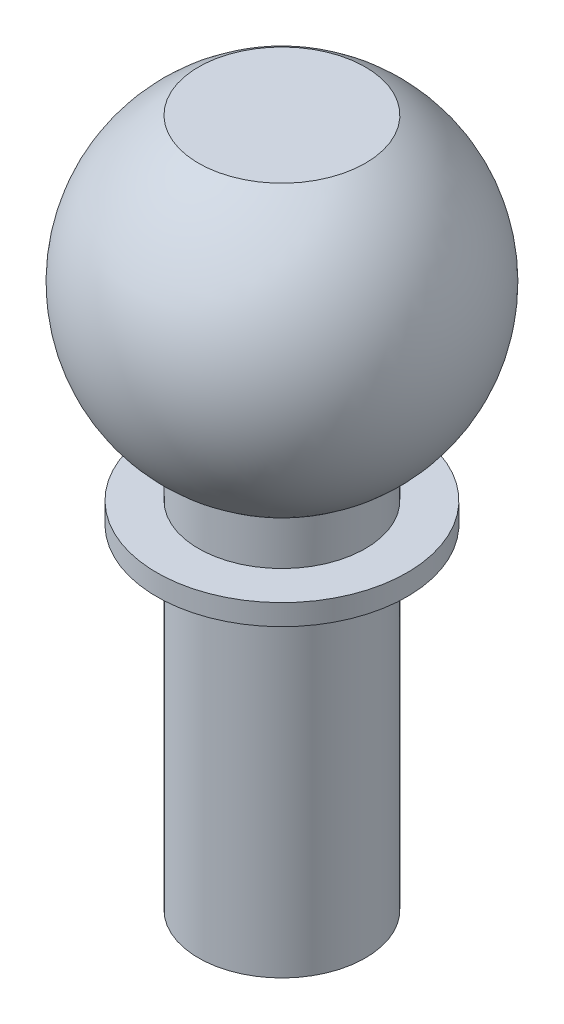
ISO-10303-21;
HEADER;
FILE_DESCRIPTION(('STEP AP214'),'2;1');
FILE_NAME('part.step','',(''),(''),'','','');
FILE_SCHEMA(('AUTOMOTIVE_DESIGN { 1 0 10303 214 1 1 1 1 }'));
ENDSEC;
DATA;
#1=APPLICATION_CONTEXT('core data for automotive mechanical design processes');
#2=APPLICATION_PROTOCOL_DEFINITION('international standard','automotive_design',2000,#1);
#3=PRODUCT_CONTEXT('',#1,'mechanical');
#4=PRODUCT('Part','Part','',(#3));
#5=PRODUCT_RELATED_PRODUCT_CATEGORY('part','',(#4));
#6=PRODUCT_DEFINITION_FORMATION('','',#4);
#7=PRODUCT_DEFINITION_CONTEXT('part definition',#1,'design');
#8=PRODUCT_DEFINITION('design','',#6,#7);
#9=PRODUCT_DEFINITION_SHAPE('','',#8);
#10=(LENGTH_UNIT() NAMED_UNIT(*) SI_UNIT(.MILLI.,.METRE.));
#11=(NAMED_UNIT(*) PLANE_ANGLE_UNIT() SI_UNIT($,.RADIAN.));
#12=(NAMED_UNIT(*) SI_UNIT($,.STERADIAN.) SOLID_ANGLE_UNIT());
#13=UNCERTAINTY_MEASURE_WITH_UNIT(LENGTH_MEASURE(1.E-05),#10,'distance_accuracy_value','');
#14=(GEOMETRIC_REPRESENTATION_CONTEXT(3) GLOBAL_UNCERTAINTY_ASSIGNED_CONTEXT((#13)) GLOBAL_UNIT_ASSIGNED_CONTEXT((#10,
#11,#12)) REPRESENTATION_CONTEXT('',''));
#15=CARTESIAN_POINT('',(0.,0.,0.));
#16=DIRECTION('',(0.,0.,1.));
#17=DIRECTION('',(1.,0.,0.));
#18=AXIS2_PLACEMENT_3D('',#15,#16,#17);
#19=CARTESIAN_POINT('',(0.,0.,0.));
#20=DIRECTION('',(0.,-1.,0.));
#21=DIRECTION('',(0.,0.,-1.));
#22=AXIS2_PLACEMENT_3D('',#19,#20,#21);
#23=PLANE('',#22);
#24=CARTESIAN_POINT('',(0.,0.,0.));
#25=DIRECTION('',(0.,-1.,0.));
#26=DIRECTION('',(0.,0.,-1.));
#27=AXIS2_PLACEMENT_3D('',#24,#25,#26);
#28=CIRCLE('',#27,20.);
#29=CARTESIAN_POINT('',(0.,0.,-20.));
#30=VERTEX_POINT('',#29);
#31=EDGE_CURVE('E10',#30,#30,#28,.T.);
#32=ORIENTED_EDGE('',*,*,#31,.T.);
#33=EDGE_LOOP('',(#32));
#34=FACE_BOUND('',#33,.T.);
#35=ADVANCED_FACE('F35',(#34),#23,.T.);
#36=CARTESIAN_POINT('',(0.,0.,0.));
#37=DIRECTION('',(0.,-1.,0.));
#38=DIRECTION('',(0.,0.,-1.));
#39=AXIS2_PLACEMENT_3D('',#36,#37,#38);
#40=CYLINDRICAL_SURFACE('',#39,20.);
#41=CARTESIAN_POINT('',(0.,80.,0.));
#42=DIRECTION('',(0.,-1.,0.));
#43=DIRECTION('',(0.,0.,-1.));
#44=AXIS2_PLACEMENT_3D('',#41,#42,#43);
#45=CIRCLE('',#44,20.);
#46=CARTESIAN_POINT('',(0.,80.,-20.));
#47=VERTEX_POINT('',#46);
#48=EDGE_CURVE('E41',#47,#47,#45,.T.);
#49=ORIENTED_EDGE('',*,*,#48,.T.);
#50=EDGE_LOOP('',(#49));
#51=FACE_BOUND('',#50,.T.);
#52=ORIENTED_EDGE('',*,*,#31,.F.);
#53=EDGE_LOOP('',(#52));
#54=FACE_BOUND('',#53,.T.);
#55=ADVANCED_FACE('F76',(#51,#54),#40,.T.);
#56=CARTESIAN_POINT('',(20.,80.,0.));
#57=DIRECTION('',(0.,-1.,0.));
#58=DIRECTION('',(0.,0.,-1.));
#59=AXIS2_PLACEMENT_3D('',#56,#57,#58);
#60=PLANE('',#59);
#61=CARTESIAN_POINT('',(0.,80.,0.));
#62=DIRECTION('',(0.,-1.,0.));
#63=DIRECTION('',(0.,0.,-1.));
#64=AXIS2_PLACEMENT_3D('',#61,#62,#63);
#65=CIRCLE('',#64,30.);
#66=CARTESIAN_POINT('',(0.,80.,-30.));
#67=VERTEX_POINT('',#66);
#68=EDGE_CURVE('E45',#67,#67,#65,.T.);
#69=ORIENTED_EDGE('',*,*,#68,.T.);
#70=EDGE_LOOP('',(#69));
#71=FACE_BOUND('',#70,.T.);
#72=ORIENTED_EDGE('',*,*,#48,.F.);
#73=EDGE_LOOP('',(#72));
#74=FACE_BOUND('',#73,.T.);
#75=ADVANCED_FACE('F80',(#71,#74),#60,.T.);
#76=CARTESIAN_POINT('',(0.,0.,0.));
#77=DIRECTION('',(0.,-1.,0.));
#78=DIRECTION('',(0.,0.,-1.));
#79=AXIS2_PLACEMENT_3D('',#76,#77,#78);
#80=CYLINDRICAL_SURFACE('',#79,30.);
#81=CARTESIAN_POINT('',(0.,85.,0.));
#82=DIRECTION('',(0.,-1.,0.));
#83=DIRECTION('',(0.,0.,-1.));
#84=AXIS2_PLACEMENT_3D('',#81,#82,#83);
#85=CIRCLE('',#84,30.);
#86=CARTESIAN_POINT('',(0.,85.,-30.));
#87=VERTEX_POINT('',#86);
#88=EDGE_CURVE('E49',#87,#87,#85,.T.);
#89=ORIENTED_EDGE('',*,*,#88,.T.);
#90=EDGE_LOOP('',(#89));
#91=FACE_BOUND('',#90,.T.);
#92=ORIENTED_EDGE('',*,*,#68,.F.);
#93=EDGE_LOOP('',(#92));
#94=FACE_BOUND('',#93,.T.);
#95=ADVANCED_FACE('F84',(#91,#94),#80,.T.);
#96=CARTESIAN_POINT('',(30.,85.,0.));
#97=DIRECTION('',(0.,1.,0.));
#98=DIRECTION('',(0.,0.,1.));
#99=AXIS2_PLACEMENT_3D('',#96,#97,#98);
#100=PLANE('',#99);
#101=CARTESIAN_POINT('',(0.,85.,0.));
#102=DIRECTION('',(0.,-1.,0.));
#103=DIRECTION('',(0.,0.,-1.));
#104=AXIS2_PLACEMENT_3D('',#101,#102,#103);
#105=CIRCLE('',#104,20.);
#106=CARTESIAN_POINT('',(0.,85.,-20.));
#107=VERTEX_POINT('',#106);
#108=EDGE_CURVE('E54',#107,#107,#105,.T.);
#109=ORIENTED_EDGE('',*,*,#108,.T.);
#110=EDGE_LOOP('',(#109));
#111=FACE_BOUND('',#110,.T.);
#112=ORIENTED_EDGE('',*,*,#88,.F.);
#113=EDGE_LOOP('',(#112));
#114=FACE_BOUND('',#113,.T.);
#115=ADVANCED_FACE('F91',(#111,#114),#100,.T.);
#116=CARTESIAN_POINT('',(0.,0.,0.));
#117=DIRECTION('',(0.,-1.,0.));
#118=DIRECTION('',(0.,0.,-1.));
#119=AXIS2_PLACEMENT_3D('',#116,#117,#118);
#120=CYLINDRICAL_SURFACE('',#119,20.);
#121=CARTESIAN_POINT('',(0.,95.7179676972449,0.));
#122=DIRECTION('',(0.,-1.,0.));
#123=DIRECTION('',(0.,0.,-1.));
#124=AXIS2_PLACEMENT_3D('',#121,#122,#123);
#125=CIRCLE('',#124,20.);
#126=CARTESIAN_POINT('',(20.,95.7179676972449,0.));
#127=VERTEX_POINT('',#126);
#128=EDGE_CURVE('E57',#127,#127,#125,.T.);
#129=ORIENTED_EDGE('',*,*,#128,.T.);
#130=EDGE_LOOP('',(#129));
#131=FACE_BOUND('',#130,.T.);
#132=ORIENTED_EDGE('',*,*,#108,.F.);
#133=EDGE_LOOP('',(#132));
#134=FACE_BOUND('',#133,.T.);
#135=ADVANCED_FACE('F73',(#131,#134),#120,.T.);
#136=CARTESIAN_POINT('',(0.,130.358983848622,0.));
#137=DIRECTION('',(0.,-1.,0.));
#138=DIRECTION('',(1.,0.,0.));
#139=AXIS2_PLACEMENT_3D('',#136,#137,#138);
#140=SPHERICAL_SURFACE('',#139,40.);
#141=CARTESIAN_POINT('',(0.,165.,0.));
#142=DIRECTION('',(0.,-1.,0.));
#143=DIRECTION('',(0.,0.,-1.));
#144=AXIS2_PLACEMENT_3D('',#141,#142,#143);
#145=CIRCLE('',#144,20.);
#146=CARTESIAN_POINT('',(20.,165.,0.));
#147=VERTEX_POINT('',#146);
#148=EDGE_CURVE('E60',#147,#147,#145,.T.);
#149=CARTESIAN_POINT('',(20.,165.,0.));
#150=CARTESIAN_POINT('',(20.3778763150764,164.781836176577,0.));
#151=CARTESIAN_POINT('',(20.752180064816,164.557484799685,0.));
#152=CARTESIAN_POINT('',(21.4932479872134,164.096657419686,0.));
#153=CARTESIAN_POINT('',(21.8600121598712,163.860181416579,0.));
#154=CARTESIAN_POINT('',(22.5856064816969,163.37535526487,0.));
#155=CARTESIAN_POINT('',(22.9444366308648,163.127005116269,0.));
#156=CARTESIAN_POINT('',(23.6537791185594,162.618697348305,0.));
#157=CARTESIAN_POINT('',(24.0042914570862,162.358739728944,0.));
#158=CARTESIAN_POINT('',(24.6966228636115,161.8274951916,0.));
#159=CARTESIAN_POINT('',(25.0384419316099,161.556208273619,0.));
#160=CARTESIAN_POINT('',(25.7130208014817,161.002595692645,0.));
#161=CARTESIAN_POINT('',(26.0457806033549,160.720270029654,0.));
#162=CARTESIAN_POINT('',(26.7018846046506,160.144882265909,0.));
#163=CARTESIAN_POINT('',(27.0252288040732,159.851820165156,0.));
#164=CARTESIAN_POINT('',(27.6621553577565,159.255273347916,0.));
#165=CARTESIAN_POINT('',(27.9757377120173,158.951788631428,0.));
#166=CARTESIAN_POINT('',(28.5928047829064,158.33472156074,0.));
#167=CARTESIAN_POINT('',(28.8962894995348,158.021139206539,0.));
#168=CARTESIAN_POINT('',(29.4928363162921,157.384212652535,0.));
#169=CARTESIAN_POINT('',(29.785898416421,157.060868452732,0.));
#170=CARTESIAN_POINT('',(30.3612861818971,156.404764452518,0.));
#171=CARTESIAN_POINT('',(30.6436118472442,156.072004652108,0.));
#172=CARTESIAN_POINT('',(31.1972244217747,155.397425778229,0.));
#173=CARTESIAN_POINT('',(31.4685113309581,155.05560670476,0.));
#174=CARTESIAN_POINT('',(31.9997558923407,154.363275313183,0.));
#175=CARTESIAN_POINT('',(32.2597135445398,154.012762995076,0.));
#176=CARTESIAN_POINT('',(32.7680212227894,153.303420451593,0.));
#177=CARTESIAN_POINT('',(33.0163712488399,152.944590226219,0.));
#178=CARTESIAN_POINT('',(33.5011977353637,152.218996112594,0.));
#179=CARTESIAN_POINT('',(33.7376741958369,151.852232224345,0.));
#180=CARTESIAN_POINT('',(34.1985003262893,151.111163524929,0.));
#181=CARTESIAN_POINT('',(34.4228499962685,150.736858713763,0.));
#182=CARTESIAN_POINT('',(34.8591823064866,149.981108983482,0.));
#183=CARTESIAN_POINT('',(35.0711649467256,149.599664064366,0.));
#184=CARTESIAN_POINT('',(35.4825362011428,148.830042578959,0.));
#185=CARTESIAN_POINT('',(35.6819248153209,148.441866012667,0.));
#186=CARTESIAN_POINT('',(36.0678945072941,147.659196902098,0.));
#187=CARTESIAN_POINT('',(36.2544755850892,147.26470435782,0.));
#188=CARTESIAN_POINT('',(36.6146304086048,146.469825723776,0.));
#189=CARTESIAN_POINT('',(36.7882041543254,146.06943963401,0.));
#190=CARTESIAN_POINT('',(37.1221584465775,145.263202652442,0.));
#191=CARTESIAN_POINT('',(37.2825389931091,144.857351760641,0.));
#192=CARTESIAN_POINT('',(37.5899351474769,144.040619770303,0.));
#193=CARTESIAN_POINT('',(37.7369507553132,143.629738671767,0.));
#194=CARTESIAN_POINT('',(38.0174596042952,142.803386249731,0.));
#195=CARTESIAN_POINT('',(38.150952845441,142.387914926232,0.));
#196=CARTESIAN_POINT('',(38.4042740131357,141.55282695137,0.));
#197=CARTESIAN_POINT('',(38.5241019396847,141.133210300007,0.));
#198=CARTESIAN_POINT('',(38.7499641634408,140.290281005439,0.));
#199=CARTESIAN_POINT('',(38.8559984606479,139.866968362234,0.));
#200=CARTESIAN_POINT('',(39.0541598815388,139.017100377761,0.));
#201=CARTESIAN_POINT('',(39.1462870052227,138.590545036494,0.));
#202=CARTESIAN_POINT('',(39.3165354270357,137.734648422041,0.));
#203=CARTESIAN_POINT('',(39.3946567251648,137.305307148856,0.));
#204=CARTESIAN_POINT('',(39.5368098416255,136.444298419956,0.));
#205=CARTESIAN_POINT('',(39.6008416599571,136.012630964242,0.));
#206=CARTESIAN_POINT('',(39.7147472499478,135.147432110607,0.));
#207=CARTESIAN_POINT('',(39.7646210216069,134.713900712688,0.));
#208=CARTESIAN_POINT('',(39.8501571121688,133.845438210922,0.));
#209=CARTESIAN_POINT('',(39.8858194310717,133.410507107077,0.));
#210=CARTESIAN_POINT('',(39.9428944280166,132.53971092858,0.));
#211=CARTESIAN_POINT('',(39.9643071060588,132.103845853928,0.));
#212=CARTESIAN_POINT('',(39.9928598920505,131.231648469059,0.));
#213=CARTESIAN_POINT('',(40.,130.795316158841,0.));
#214=CARTESIAN_POINT('',(40.,129.922651538404,0.));
#215=CARTESIAN_POINT('',(39.9928598920505,129.486319228186,0.));
#216=CARTESIAN_POINT('',(39.9643071060588,128.614121843317,0.));
#217=CARTESIAN_POINT('',(39.9428944280166,128.178256768665,0.));
#218=CARTESIAN_POINT('',(39.8858194310717,127.307460590168,0.));
#219=CARTESIAN_POINT('',(39.8501571121688,126.872529486323,0.));
#220=CARTESIAN_POINT('',(39.7646210216069,126.004066984557,0.));
#221=CARTESIAN_POINT('',(39.7147472499478,125.570535586638,0.));
#222=CARTESIAN_POINT('',(39.6008416599571,124.705336733003,0.));
#223=CARTESIAN_POINT('',(39.5368098416255,124.273669277289,0.));
#224=CARTESIAN_POINT('',(39.3946567251648,123.412660548389,0.));
#225=CARTESIAN_POINT('',(39.3165354270357,122.983319275204,0.));
#226=CARTESIAN_POINT('',(39.1462870052227,122.127422660751,0.));
#227=CARTESIAN_POINT('',(39.0541598815388,121.700867319484,0.));
#228=CARTESIAN_POINT('',(38.8559984606479,120.850999335011,0.));
#229=CARTESIAN_POINT('',(38.7499641634408,120.427686691806,0.));
#230=CARTESIAN_POINT('',(38.5241019396847,119.584757397238,0.));
#231=CARTESIAN_POINT('',(38.4042740131357,119.165140745875,0.));
#232=CARTESIAN_POINT('',(38.150952845441,118.330052771013,0.));
#233=CARTESIAN_POINT('',(38.0174596042952,117.914581447514,0.));
#234=CARTESIAN_POINT('',(37.7369507553132,117.088229025478,0.));
#235=CARTESIAN_POINT('',(37.589935147477,116.677347926942,0.));
#236=CARTESIAN_POINT('',(37.2825389931091,115.860615936604,0.));
#237=CARTESIAN_POINT('',(37.1221584465776,115.454765044803,0.));
#238=CARTESIAN_POINT('',(36.7882041543254,114.648528063235,0.));
#239=CARTESIAN_POINT('',(36.6146304086049,114.248141973469,0.));
#240=CARTESIAN_POINT('',(36.2544755850892,113.453263339425,0.));
#241=CARTESIAN_POINT('',(36.0678945072942,113.058770795147,0.));
#242=CARTESIAN_POINT('',(35.6819248153209,112.276101684578,0.));
#243=CARTESIAN_POINT('',(35.4825362011428,111.887925118286,0.));
#244=CARTESIAN_POINT('',(35.0711649467256,111.118303632879,0.));
#245=CARTESIAN_POINT('',(34.8591823064866,110.736858713763,0.));
#246=CARTESIAN_POINT('',(34.4228499962685,109.981108983482,0.));
#247=CARTESIAN_POINT('',(34.1985003262894,109.606804172316,0.));
#248=CARTESIAN_POINT('',(33.737674195837,108.8657354729,0.));
#249=CARTESIAN_POINT('',(33.5011977353637,108.498971584651,0.));
#250=CARTESIAN_POINT('',(33.0163712488399,107.773377471026,0.));
#251=CARTESIAN_POINT('',(32.7680212227894,107.414547245652,0.));
#252=CARTESIAN_POINT('',(32.2597135445398,106.705204702169,0.));
#253=CARTESIAN_POINT('',(31.9997558923407,106.354692384062,0.));
#254=CARTESIAN_POINT('',(31.4685113309582,105.662360992485,0.));
#255=CARTESIAN_POINT('',(31.1972244217747,105.320541919016,0.));
#256=CARTESIAN_POINT('',(30.6436118472442,104.645963045137,0.));
#257=CARTESIAN_POINT('',(30.3612861818972,104.313203244727,0.));
#258=CARTESIAN_POINT('',(29.7858984164211,103.657099244513,0.));
#259=CARTESIAN_POINT('',(29.4928363162921,103.33375504471,0.));
#260=CARTESIAN_POINT('',(28.8962894995348,102.696828490706,0.));
#261=CARTESIAN_POINT('',(28.5928047829065,102.383246136505,0.));
#262=CARTESIAN_POINT('',(27.9757377120174,101.766179065817,0.));
#263=CARTESIAN_POINT('',(27.6621553577565,101.462694349329,0.));
#264=CARTESIAN_POINT('',(27.0252288040732,100.866147532089,0.));
#265=CARTESIAN_POINT('',(26.7018846046507,100.573085431336,0.));
#266=CARTESIAN_POINT('',(26.0457806033549,99.9976976675911,0.));
#267=CARTESIAN_POINT('',(25.7130208014817,99.7153720045996,0.));
#268=CARTESIAN_POINT('',(25.03844193161,99.1617594236264,0.));
#269=CARTESIAN_POINT('',(24.6966228636115,98.8904725056448,0.));
#270=CARTESIAN_POINT('',(24.0042914570862,98.3592279683013,0.));
#271=CARTESIAN_POINT('',(23.6537791185594,98.0992703489394,0.));
#272=CARTESIAN_POINT('',(22.9444366308648,97.5909625809763,0.));
#273=CARTESIAN_POINT('',(22.5856064816969,97.342612432375,0.));
#274=CARTESIAN_POINT('',(21.8600121598713,96.8577862806663,0.));
#275=CARTESIAN_POINT('',(21.4932479872135,96.6213102775589,0.));
#276=CARTESIAN_POINT('',(20.752180064816,96.1604828975597,0.));
#277=CARTESIAN_POINT('',(20.3778763150764,95.936131520668,0.));
#278=CARTESIAN_POINT('',(20.,95.7179676972449,0.));
#279=B_SPLINE_CURVE_WITH_KNOTS('',3,(#149,#150,#151,#152,#153,#154,#155,#156,#157,#158,#159,
#160,#161,#162,#163,#164,#165,#166,#167,#168,#169,#170,#171,#172,#173,#174,#175,#176,#177,#178,
#179,#180,#181,#182,#183,#184,#185,#186,#187,#188,#189,#190,#191,#192,#193,#194,#195,#196,#197,
#198,#199,#200,#201,#202,#203,#204,#205,#206,#207,#208,#209,#210,#211,#212,#213,#214,#215,#216,
#217,#218,#219,#220,#221,#222,#223,#224,#225,#226,#227,#228,#229,#230,#231,#232,#233,#234,#235,
#236,#237,#238,#239,#240,#241,#242,#243,#244,#245,#246,#247,#248,#249,#250,#251,#252,#253,#254,
#255,#256,#257,#258,#259,#260,#261,#262,#263,#264,#265,#266,#267,#268,#269,#270,#271,#272,#273,
#274,#275,#276,#277,#278),.UNSPECIFIED.,.F.,.F.,(4,2,2,2,2,2,2,2,2,2,2,2,2,2,2,2,2,2,2,2,2,2,2,
2,2,2,2,2,2,2,2,2,2,2,2,2,2,2,2,2,2,2,2,2,2,2,2,2,2,2,2,2,2,2,2,2,2,2,2,2,2,2,2,2,4),(0.,
1.30893853011895,2.6178770602379,3.92681559035683,5.23575412047578,6.54469265059472,
7.85363118071367,9.1625697108326,10.4715082409516,11.7804467710705,13.0893853011894,
14.3983238313084,15.7072623614273,17.0162008915463,18.3251394216652,19.6340779517841,
20.9430164819031,22.251955012022,23.560893542141,24.8698320722599,26.1787706023788,
27.4877091324978,28.7966476626167,30.1055861927357,31.4145247228546,32.7234632529736,
34.0324017830925,35.3413403132115,36.6502788433304,37.9592173734493,39.2681559035683,
40.5770944336872,41.8860329638062,43.1949714939251,44.5039100240441,45.812848554163,
47.121787084282,48.4307256144009,49.7396641445198,51.0486026746388,52.3575412047577,
53.6664797348766,54.9754182649956,56.2843567951145,57.5932953252335,58.9022338553524,
60.2111723854714,61.5201109155903,62.8290494457092,64.1379879758282,65.4469265059471,
66.7558650360661,68.064803566185,69.3737420963039,70.6826806264229,71.9916191565418,
73.3005576866608,74.6094962167797,75.9184347468987,77.2273732770176,78.5363118071365,
79.8452503372555,81.1541888673744,82.4631273974934,83.7720659276123),.UNSPECIFIED.);
#280=EDGE_CURVE('BSEAM64',#147,#127,#279,.T.);
#281=ORIENTED_EDGE('',*,*,#148,.T.);
#282=ORIENTED_EDGE('',*,*,#128,.F.);
#283=ORIENTED_EDGE('',*,*,#280,.T.);
#284=ORIENTED_EDGE('',*,*,#280,.F.);
#285=EDGE_LOOP('',(#281,#283,#282,#284));
#286=FACE_BOUND('',#285,.T.);
#287=ADVANCED_FACE('F64',(#286),#140,.T.);
#288=CARTESIAN_POINT('',(0.,165.,0.));
#289=DIRECTION('',(0.,1.,0.));
#290=DIRECTION('',(0.,0.,1.));
#291=AXIS2_PLACEMENT_3D('',#288,#289,#290);
#292=PLANE('',#291);
#293=ORIENTED_EDGE('',*,*,#148,.F.);
#294=EDGE_LOOP('',(#293));
#295=FACE_BOUND('',#294,.T.);
#296=ADVANCED_FACE('F67',(#295),#292,.T.);
#297=CLOSED_SHELL('',(#35,#55,#75,#95,#115,#135,#287,#296));
#298=MANIFOLD_SOLID_BREP('B2',#297);
#299=ADVANCED_BREP_SHAPE_REPRESENTATION('',(#18,#298),#14);
#300=SHAPE_DEFINITION_REPRESENTATION(#9,#299);
ENDSEC;
END-ISO-10303-21;
